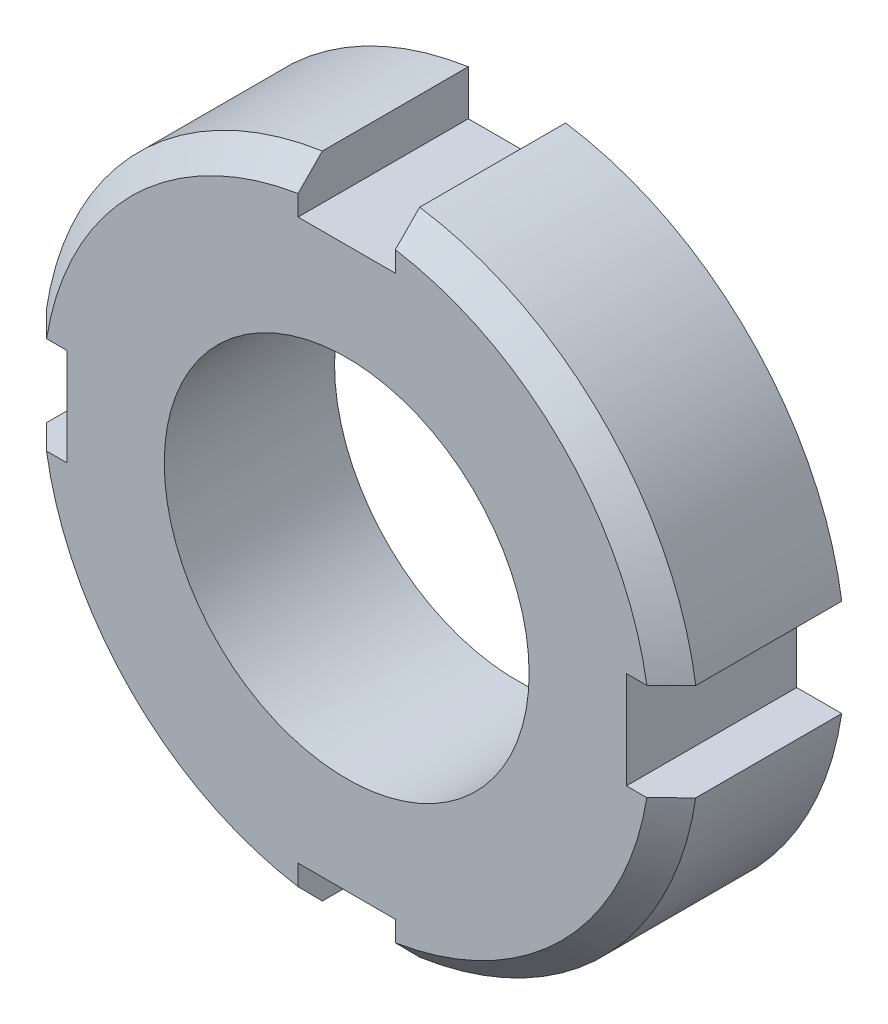
ISO-10303-21;
HEADER;
FILE_DESCRIPTION(('STEP AP214'),'2;1');
FILE_NAME('part.step','',(''),(''),'','','');
FILE_SCHEMA(('AUTOMOTIVE_DESIGN { 1 0 10303 214 1 1 1 1 }'));
ENDSEC;
DATA;
#1=APPLICATION_CONTEXT('core data for automotive mechanical design processes');
#2=APPLICATION_PROTOCOL_DEFINITION('international standard','automotive_design',2000,#1);
#3=PRODUCT_CONTEXT('',#1,'mechanical');
#4=PRODUCT('Part','Part','',(#3));
#5=PRODUCT_RELATED_PRODUCT_CATEGORY('part','',(#4));
#6=PRODUCT_DEFINITION_FORMATION('','',#4);
#7=PRODUCT_DEFINITION_CONTEXT('part definition',#1,'design');
#8=PRODUCT_DEFINITION('design','',#6,#7);
#9=PRODUCT_DEFINITION_SHAPE('','',#8);
#10=(LENGTH_UNIT() NAMED_UNIT(*) SI_UNIT(.MILLI.,.METRE.));
#11=(NAMED_UNIT(*) PLANE_ANGLE_UNIT() SI_UNIT($,.RADIAN.));
#12=(NAMED_UNIT(*) SI_UNIT($,.STERADIAN.) SOLID_ANGLE_UNIT());
#13=UNCERTAINTY_MEASURE_WITH_UNIT(LENGTH_MEASURE(1.E-05),#10,'distance_accuracy_value','');
#14=(GEOMETRIC_REPRESENTATION_CONTEXT(3) GLOBAL_UNCERTAINTY_ASSIGNED_CONTEXT((#13)) GLOBAL_UNIT_ASSIGNED_CONTEXT((#10,
#11,#12)) REPRESENTATION_CONTEXT('',''));
#15=CARTESIAN_POINT('',(0.,0.,0.));
#16=DIRECTION('',(0.,0.,1.));
#17=DIRECTION('',(1.,0.,0.));
#18=AXIS2_PLACEMENT_3D('',#15,#16,#17);
#19=CARTESIAN_POINT('',(0.,0.,7.));
#20=DIRECTION('',(0.,0.,-1.));
#21=DIRECTION('',(-1.,0.,0.));
#22=AXIS2_PLACEMENT_3D('',#19,#20,#21);
#23=CYLINDRICAL_SURFACE('',#22,13.5);
#24=DIRECTION('',(0.,0.,-1.));
#25=VECTOR('',#24,1.);
#26=CARTESIAN_POINT('',(-13.3510299228187,2.00000000000014,7.));
#27=LINE('',#26,#25);
#28=CARTESIAN_POINT('',(-13.3510299228187,2.00000000000014,0.));
#29=VERTEX_POINT('',#28);
#30=CARTESIAN_POINT('',(-13.3510299228187,2.00000000000014,6.));
#31=VERTEX_POINT('',#30);
#32=EDGE_CURVE('E190',#29,#31,#27,.F.);
#33=ORIENTED_EDGE('',*,*,#32,.T.);
#34=CARTESIAN_POINT('',(0.,0.,6.));
#35=DIRECTION('',(0.,0.,1.));
#36=DIRECTION('',(1.,0.,0.));
#37=AXIS2_PLACEMENT_3D('',#34,#35,#36);
#38=CIRCLE('',#37,13.5);
#39=CARTESIAN_POINT('',(-2.,13.3510299228187,6.));
#40=VERTEX_POINT('',#39);
#41=EDGE_CURVE('E48',#31,#40,#38,.F.);
#42=ORIENTED_EDGE('',*,*,#41,.T.);
#43=DIRECTION('',(0.,0.,-1.));
#44=VECTOR('',#43,1.);
#45=CARTESIAN_POINT('',(-2.,13.3510299228187,7.));
#46=LINE('',#45,#44);
#47=CARTESIAN_POINT('',(-2.,13.3510299228187,0.));
#48=VERTEX_POINT('',#47);
#49=EDGE_CURVE('E275',#40,#48,#46,.T.);
#50=ORIENTED_EDGE('',*,*,#49,.T.);
#51=CARTESIAN_POINT('',(0.,0.,0.));
#52=DIRECTION('',(0.,0.,1.));
#53=DIRECTION('',(1.,0.,0.));
#54=AXIS2_PLACEMENT_3D('',#51,#52,#53);
#55=CIRCLE('',#54,13.5);
#56=EDGE_CURVE('E289',#48,#29,#55,.T.);
#57=ORIENTED_EDGE('',*,*,#56,.T.);
#58=EDGE_LOOP('',(#33,#42,#50,#57));
#59=FACE_BOUND('',#58,.T.);
#60=ADVANCED_FACE('F35',(#59),#23,.T.);
#61=DIRECTION('',(0.,0.,-1.));
#62=VECTOR('',#61,1.);
#63=CARTESIAN_POINT('',(-2.00000000000009,-13.3510299228187,7.));
#64=LINE('',#63,#62);
#65=CARTESIAN_POINT('',(-2.00000000000009,-13.3510299228187,0.));
#66=VERTEX_POINT('',#65);
#67=CARTESIAN_POINT('',(-2.00000000000009,-13.3510299228187,5.99999999999999));
#68=VERTEX_POINT('',#67);
#69=EDGE_CURVE('E231',#66,#68,#64,.F.);
#70=ORIENTED_EDGE('',*,*,#69,.T.);
#71=CARTESIAN_POINT('',(0.,0.,5.99999999999999));
#72=DIRECTION('',(0.,0.,1.));
#73=DIRECTION('',(1.,0.,0.));
#74=AXIS2_PLACEMENT_3D('',#71,#72,#73);
#75=CIRCLE('',#74,13.5);
#76=CARTESIAN_POINT('',(-13.3510299228187,-1.99999999999986,5.99999999999999));
#77=VERTEX_POINT('',#76);
#78=EDGE_CURVE('E453',#68,#77,#75,.F.);
#79=ORIENTED_EDGE('',*,*,#78,.T.);
#80=DIRECTION('',(0.,0.,-1.));
#81=VECTOR('',#80,1.);
#82=CARTESIAN_POINT('',(-13.3510299228187,-1.99999999999986,7.));
#83=LINE('',#82,#81);
#84=CARTESIAN_POINT('',(-13.3510299228187,-1.99999999999986,0.));
#85=VERTEX_POINT('',#84);
#86=EDGE_CURVE('E184',#77,#85,#83,.T.);
#87=ORIENTED_EDGE('',*,*,#86,.T.);
#88=EDGE_CURVE('E292',#85,#66,#55,.T.);
#89=ORIENTED_EDGE('',*,*,#88,.T.);
#90=EDGE_LOOP('',(#70,#79,#87,#89));
#91=FACE_BOUND('',#90,.T.);
#92=ADVANCED_FACE('F352',(#91),#23,.T.);
#93=DIRECTION('',(0.,0.,-1.));
#94=VECTOR('',#93,1.);
#95=CARTESIAN_POINT('',(13.3510299228187,-2.00000000000005,7.));
#96=LINE('',#95,#94);
#97=CARTESIAN_POINT('',(13.3510299228187,-2.00000000000005,0.));
#98=VERTEX_POINT('',#97);
#99=CARTESIAN_POINT('',(13.3510299228187,-2.00000000000005,6.));
#100=VERTEX_POINT('',#99);
#101=EDGE_CURVE('E255',#98,#100,#96,.F.);
#102=ORIENTED_EDGE('',*,*,#101,.T.);
#103=CARTESIAN_POINT('',(0.,0.,6.));
#104=DIRECTION('',(0.,0.,1.));
#105=DIRECTION('',(1.,0.,0.));
#106=AXIS2_PLACEMENT_3D('',#103,#104,#105);
#107=CIRCLE('',#106,13.5);
#108=CARTESIAN_POINT('',(1.99999999999991,-13.3510299228187,6.));
#109=VERTEX_POINT('',#108);
#110=EDGE_CURVE('E400',#100,#109,#107,.F.);
#111=ORIENTED_EDGE('',*,*,#110,.T.);
#112=DIRECTION('',(0.,0.,-1.));
#113=VECTOR('',#112,1.);
#114=CARTESIAN_POINT('',(1.99999999999991,-13.3510299228187,7.));
#115=LINE('',#114,#113);
#116=CARTESIAN_POINT('',(1.99999999999991,-13.3510299228187,0.));
#117=VERTEX_POINT('',#116);
#118=EDGE_CURVE('E227',#109,#117,#115,.T.);
#119=ORIENTED_EDGE('',*,*,#118,.T.);
#120=EDGE_CURVE('E457',#117,#98,#55,.T.);
#121=ORIENTED_EDGE('',*,*,#120,.T.);
#122=EDGE_LOOP('',(#102,#111,#119,#121));
#123=FACE_BOUND('',#122,.T.);
#124=ADVANCED_FACE('F347',(#123),#23,.T.);
#125=DIRECTION('',(0.,0.,-1.));
#126=VECTOR('',#125,1.);
#127=CARTESIAN_POINT('',(2.,13.3510299228187,7.));
#128=LINE('',#127,#126);
#129=CARTESIAN_POINT('',(2.,13.3510299228187,0.));
#130=VERTEX_POINT('',#129);
#131=CARTESIAN_POINT('',(2.,13.3510299228187,6.));
#132=VERTEX_POINT('',#131);
#133=EDGE_CURVE('E279',#130,#132,#128,.F.);
#134=ORIENTED_EDGE('',*,*,#133,.T.);
#135=CARTESIAN_POINT('',(0.,0.,6.));
#136=DIRECTION('',(0.,0.,1.));
#137=DIRECTION('',(1.,0.,0.));
#138=AXIS2_PLACEMENT_3D('',#135,#136,#137);
#139=CIRCLE('',#138,13.5);
#140=CARTESIAN_POINT('',(13.3510299228187,1.99999999999995,6.));
#141=VERTEX_POINT('',#140);
#142=EDGE_CURVE('E321',#132,#141,#139,.F.);
#143=ORIENTED_EDGE('',*,*,#142,.T.);
#144=DIRECTION('',(0.,0.,-1.));
#145=VECTOR('',#144,1.);
#146=CARTESIAN_POINT('',(13.3510299228187,1.99999999999995,7.));
#147=LINE('',#146,#145);
#148=CARTESIAN_POINT('',(13.3510299228187,1.99999999999995,0.));
#149=VERTEX_POINT('',#148);
#150=EDGE_CURVE('E251',#141,#149,#147,.T.);
#151=ORIENTED_EDGE('',*,*,#150,.T.);
#152=EDGE_CURVE('E286',#149,#130,#55,.T.);
#153=ORIENTED_EDGE('',*,*,#152,.T.);
#154=EDGE_LOOP('',(#134,#143,#151,#153));
#155=FACE_BOUND('',#154,.T.);
#156=ADVANCED_FACE('F342',(#155),#23,.T.);
#157=CARTESIAN_POINT('',(0.,0.,7.));
#158=DIRECTION('',(0.,0.,1.));
#159=DIRECTION('',(1.,0.,0.));
#160=AXIS2_PLACEMENT_3D('',#157,#158,#159);
#161=PLANE('',#160);
#162=DIRECTION('',(-1.,0.,0.));
#163=VECTOR('',#162,1.);
#164=CARTESIAN_POINT('',(15.5,1.99999999999995,7.));
#165=LINE('',#164,#163);
#166=CARTESIAN_POINT('',(12.3389626792531,1.99999999999996,7.));
#167=VERTEX_POINT('',#166);
#168=CARTESIAN_POINT('',(11.5,1.99999999999996,7.));
#169=VERTEX_POINT('',#168);
#170=EDGE_CURVE('E245',#167,#169,#165,.T.);
#171=ORIENTED_EDGE('',*,*,#170,.F.);
#172=CARTESIAN_POINT('',(0.,0.,7.));
#173=DIRECTION('',(0.,0.,1.));
#174=DIRECTION('',(1.,0.,0.));
#175=AXIS2_PLACEMENT_3D('',#172,#173,#174);
#176=CIRCLE('',#175,12.5);
#177=CARTESIAN_POINT('',(2.,12.3389626792531,7.));
#178=VERTEX_POINT('',#177);
#179=EDGE_CURVE('E311',#167,#178,#176,.T.);
#180=ORIENTED_EDGE('',*,*,#179,.T.);
#181=DIRECTION('',(0.,1.,0.));
#182=VECTOR('',#181,1.);
#183=CARTESIAN_POINT('',(2.,15.5,7.));
#184=LINE('',#183,#182);
#185=CARTESIAN_POINT('',(2.,11.5,7.));
#186=VERTEX_POINT('',#185);
#187=EDGE_CURVE('E258',#186,#178,#184,.T.);
#188=ORIENTED_EDGE('',*,*,#187,.F.);
#189=DIRECTION('',(1.,0.,0.));
#190=VECTOR('',#189,1.);
#191=CARTESIAN_POINT('',(-2.,11.5,7.));
#192=LINE('',#191,#190);
#193=CARTESIAN_POINT('',(-2.,11.5,7.));
#194=VERTEX_POINT('',#193);
#195=EDGE_CURVE('E263',#194,#186,#192,.T.);
#196=ORIENTED_EDGE('',*,*,#195,.F.);
#197=DIRECTION('',(0.,-1.,0.));
#198=VECTOR('',#197,1.);
#199=CARTESIAN_POINT('',(-2.,15.5,7.));
#200=LINE('',#199,#198);
#201=CARTESIAN_POINT('',(-2.,12.3389626792531,7.));
#202=VERTEX_POINT('',#201);
#203=EDGE_CURVE('E269',#202,#194,#200,.T.);
#204=ORIENTED_EDGE('',*,*,#203,.F.);
#205=CARTESIAN_POINT('',(0.,0.,7.));
#206=DIRECTION('',(0.,0.,1.));
#207=DIRECTION('',(1.,0.,0.));
#208=AXIS2_PLACEMENT_3D('',#205,#206,#207);
#209=CIRCLE('',#208,12.5);
#210=CARTESIAN_POINT('',(-12.338962679253,2.00000000000013,7.));
#211=VERTEX_POINT('',#210);
#212=EDGE_CURVE('E302',#202,#211,#209,.T.);
#213=ORIENTED_EDGE('',*,*,#212,.T.);
#214=DIRECTION('',(-1.,0.,0.));
#215=VECTOR('',#214,1.);
#216=CARTESIAN_POINT('',(-15.5,2.00000000000016,7.));
#217=LINE('',#216,#215);
#218=CARTESIAN_POINT('',(-11.5,2.00000000000012,7.));
#219=VERTEX_POINT('',#218);
#220=EDGE_CURVE('E203',#219,#211,#217,.T.);
#221=ORIENTED_EDGE('',*,*,#220,.F.);
#222=DIRECTION('',(0.,1.,0.));
#223=VECTOR('',#222,1.);
#224=CARTESIAN_POINT('',(-11.5,-1.99999999999988,7.));
#225=LINE('',#224,#223);
#226=CARTESIAN_POINT('',(-11.5,-1.99999999999988,7.));
#227=VERTEX_POINT('',#226);
#228=EDGE_CURVE('E182',#227,#219,#225,.T.);
#229=ORIENTED_EDGE('',*,*,#228,.F.);
#230=DIRECTION('',(1.,0.,0.));
#231=VECTOR('',#230,1.);
#232=CARTESIAN_POINT('',(-15.5,-1.99999999999984,7.));
#233=LINE('',#232,#231);
#234=CARTESIAN_POINT('',(-12.3389626792531,-1.99999999999987,7.));
#235=VERTEX_POINT('',#234);
#236=EDGE_CURVE('E205',#235,#227,#233,.T.);
#237=ORIENTED_EDGE('',*,*,#236,.F.);
#238=CARTESIAN_POINT('',(0.,0.,7.));
#239=DIRECTION('',(0.,0.,1.));
#240=DIRECTION('',(1.,0.,0.));
#241=AXIS2_PLACEMENT_3D('',#238,#239,#240);
#242=CIRCLE('',#241,12.5);
#243=CARTESIAN_POINT('',(-2.00000000000009,-12.3389626792531,7.));
#244=VERTEX_POINT('',#243);
#245=EDGE_CURVE('E305',#235,#244,#242,.T.);
#246=ORIENTED_EDGE('',*,*,#245,.T.);
#247=DIRECTION('',(0.,-1.,0.));
#248=VECTOR('',#247,1.);
#249=CARTESIAN_POINT('',(-2.00000000000011,-15.5,7.));
#250=LINE('',#249,#248);
#251=CARTESIAN_POINT('',(-2.00000000000008,-11.5,7.));
#252=VERTEX_POINT('',#251);
#253=EDGE_CURVE('E210',#252,#244,#250,.T.);
#254=ORIENTED_EDGE('',*,*,#253,.F.);
#255=DIRECTION('',(-1.,0.,0.));
#256=VECTOR('',#255,1.);
#257=CARTESIAN_POINT('',(1.99999999999992,-11.5,7.));
#258=LINE('',#257,#256);
#259=CARTESIAN_POINT('',(1.99999999999992,-11.5,7.));
#260=VERTEX_POINT('',#259);
#261=EDGE_CURVE('E215',#260,#252,#258,.T.);
#262=ORIENTED_EDGE('',*,*,#261,.F.);
#263=DIRECTION('',(0.,1.,0.));
#264=VECTOR('',#263,1.);
#265=CARTESIAN_POINT('',(1.99999999999989,-15.5,7.));
#266=LINE('',#265,#264);
#267=CARTESIAN_POINT('',(1.99999999999991,-12.3389626792531,7.));
#268=VERTEX_POINT('',#267);
#269=EDGE_CURVE('E221',#268,#260,#266,.T.);
#270=ORIENTED_EDGE('',*,*,#269,.F.);
#271=CARTESIAN_POINT('',(0.,0.,7.));
#272=DIRECTION('',(0.,0.,1.));
#273=DIRECTION('',(1.,0.,0.));
#274=AXIS2_PLACEMENT_3D('',#271,#272,#273);
#275=CIRCLE('',#274,12.5);
#276=CARTESIAN_POINT('',(12.3389626792531,-2.00000000000004,7.));
#277=VERTEX_POINT('',#276);
#278=EDGE_CURVE('E308',#268,#277,#275,.T.);
#279=ORIENTED_EDGE('',*,*,#278,.T.);
#280=DIRECTION('',(1.,0.,0.));
#281=VECTOR('',#280,1.);
#282=CARTESIAN_POINT('',(15.5,-2.00000000000005,7.));
#283=LINE('',#282,#281);
#284=CARTESIAN_POINT('',(11.5,-2.00000000000004,7.));
#285=VERTEX_POINT('',#284);
#286=EDGE_CURVE('E234',#285,#277,#283,.T.);
#287=ORIENTED_EDGE('',*,*,#286,.F.);
#288=DIRECTION('',(0.,-1.,0.));
#289=VECTOR('',#288,1.);
#290=CARTESIAN_POINT('',(11.5,1.99999999999996,7.));
#291=LINE('',#290,#289);
#292=EDGE_CURVE('E239',#169,#285,#291,.T.);
#293=ORIENTED_EDGE('',*,*,#292,.F.);
#294=EDGE_LOOP('',(#171,#180,#188,#196,#204,#213,#221,#229,#237,#246,#254,#262,#270,#279,#287,#293));
#295=FACE_BOUND('',#294,.T.);
#296=CARTESIAN_POINT('',(0.,0.,7.));
#297=DIRECTION('',(0.,0.,1.));
#298=DIRECTION('',(1.,0.,0.));
#299=AXIS2_PLACEMENT_3D('',#296,#297,#298);
#300=CIRCLE('',#299,7.5);
#301=CARTESIAN_POINT('',(7.5,0.,7.));
#302=VERTEX_POINT('',#301);
#303=EDGE_CURVE('E282',#302,#302,#300,.T.);
#304=ORIENTED_EDGE('',*,*,#303,.F.);
#305=EDGE_LOOP('',(#304));
#306=FACE_BOUND('',#305,.T.);
#307=ADVANCED_FACE('F339',(#295,#306),#161,.T.);
#308=CARTESIAN_POINT('',(0.,0.,0.));
#309=DIRECTION('',(0.,0.,1.));
#310=DIRECTION('',(1.,0.,0.));
#311=AXIS2_PLACEMENT_3D('',#308,#309,#310);
#312=PLANE('',#311);
#313=CARTESIAN_POINT('',(0.,0.,0.));
#314=DIRECTION('',(0.,0.,1.));
#315=DIRECTION('',(1.,0.,0.));
#316=AXIS2_PLACEMENT_3D('',#313,#314,#315);
#317=CIRCLE('',#316,7.5);
#318=CARTESIAN_POINT('',(7.5,0.,0.));
#319=VERTEX_POINT('',#318);
#320=EDGE_CURVE('E283',#319,#319,#317,.T.);
#321=ORIENTED_EDGE('',*,*,#320,.T.);
#322=EDGE_LOOP('',(#321));
#323=FACE_BOUND('',#322,.T.);
#324=DIRECTION('',(0.,1.,0.));
#325=VECTOR('',#324,1.);
#326=CARTESIAN_POINT('',(-11.5,-1.99999999999988,0.));
#327=LINE('',#326,#325);
#328=CARTESIAN_POINT('',(-11.5,-1.99999999999988,0.));
#329=VERTEX_POINT('',#328);
#330=CARTESIAN_POINT('',(-11.5,2.00000000000012,0.));
#331=VERTEX_POINT('',#330);
#332=EDGE_CURVE('E179',#329,#331,#327,.T.);
#333=ORIENTED_EDGE('',*,*,#332,.T.);
#334=DIRECTION('',(-1.,0.,0.));
#335=VECTOR('',#334,1.);
#336=CARTESIAN_POINT('',(-15.5,2.00000000000016,0.));
#337=LINE('',#336,#335);
#338=EDGE_CURVE('E188',#331,#29,#337,.T.);
#339=ORIENTED_EDGE('',*,*,#338,.T.);
#340=ORIENTED_EDGE('',*,*,#56,.F.);
#341=DIRECTION('',(0.,-1.,0.));
#342=VECTOR('',#341,1.);
#343=CARTESIAN_POINT('',(-2.,0.,0.));
#344=LINE('',#343,#342);
#345=CARTESIAN_POINT('',(-2.,11.5,0.));
#346=VERTEX_POINT('',#345);
#347=EDGE_CURVE('E291',#48,#346,#344,.T.);
#348=ORIENTED_EDGE('',*,*,#347,.T.);
#349=DIRECTION('',(1.,0.,0.));
#350=VECTOR('',#349,1.);
#351=CARTESIAN_POINT('',(-2.,11.5,0.));
#352=LINE('',#351,#350);
#353=CARTESIAN_POINT('',(2.,11.5,0.));
#354=VERTEX_POINT('',#353);
#355=EDGE_CURVE('E262',#346,#354,#352,.T.);
#356=ORIENTED_EDGE('',*,*,#355,.T.);
#357=DIRECTION('',(0.,1.,0.));
#358=VECTOR('',#357,1.);
#359=CARTESIAN_POINT('',(2.,15.5,0.));
#360=LINE('',#359,#358);
#361=EDGE_CURVE('E259',#354,#130,#360,.T.);
#362=ORIENTED_EDGE('',*,*,#361,.T.);
#363=ORIENTED_EDGE('',*,*,#152,.F.);
#364=DIRECTION('',(-1.,0.,0.));
#365=VECTOR('',#364,1.);
#366=CARTESIAN_POINT('',(0.,2.,0.));
#367=LINE('',#366,#365);
#368=CARTESIAN_POINT('',(11.5,1.99999999999996,0.));
#369=VERTEX_POINT('',#368);
#370=EDGE_CURVE('E295',#149,#369,#367,.T.);
#371=ORIENTED_EDGE('',*,*,#370,.T.);
#372=DIRECTION('',(0.,-1.,0.));
#373=VECTOR('',#372,1.);
#374=CARTESIAN_POINT('',(11.5,1.99999999999996,0.));
#375=LINE('',#374,#373);
#376=CARTESIAN_POINT('',(11.5,-2.00000000000004,0.));
#377=VERTEX_POINT('',#376);
#378=EDGE_CURVE('E238',#369,#377,#375,.T.);
#379=ORIENTED_EDGE('',*,*,#378,.T.);
#380=DIRECTION('',(1.,0.,0.));
#381=VECTOR('',#380,1.);
#382=CARTESIAN_POINT('',(15.5,-2.00000000000005,0.));
#383=LINE('',#382,#381);
#384=EDGE_CURVE('E235',#377,#98,#383,.T.);
#385=ORIENTED_EDGE('',*,*,#384,.T.);
#386=ORIENTED_EDGE('',*,*,#120,.F.);
#387=DIRECTION('',(0.,1.,0.));
#388=VECTOR('',#387,1.);
#389=CARTESIAN_POINT('',(2.,0.,0.));
#390=LINE('',#389,#388);
#391=CARTESIAN_POINT('',(1.99999999999992,-11.5,0.));
#392=VERTEX_POINT('',#391);
#393=EDGE_CURVE('E298',#117,#392,#390,.T.);
#394=ORIENTED_EDGE('',*,*,#393,.T.);
#395=DIRECTION('',(-1.,0.,0.));
#396=VECTOR('',#395,1.);
#397=CARTESIAN_POINT('',(1.99999999999992,-11.5,0.));
#398=LINE('',#397,#396);
#399=CARTESIAN_POINT('',(-2.00000000000008,-11.5,0.));
#400=VERTEX_POINT('',#399);
#401=EDGE_CURVE('E214',#392,#400,#398,.T.);
#402=ORIENTED_EDGE('',*,*,#401,.T.);
#403=DIRECTION('',(0.,-1.,0.));
#404=VECTOR('',#403,1.);
#405=CARTESIAN_POINT('',(-2.00000000000011,-15.5,0.));
#406=LINE('',#405,#404);
#407=EDGE_CURVE('E211',#400,#66,#406,.T.);
#408=ORIENTED_EDGE('',*,*,#407,.T.);
#409=ORIENTED_EDGE('',*,*,#88,.F.);
#410=DIRECTION('',(1.,0.,0.));
#411=VECTOR('',#410,1.);
#412=CARTESIAN_POINT('',(0.,-2.,0.));
#413=LINE('',#412,#411);
#414=EDGE_CURVE('E199',#85,#329,#413,.T.);
#415=ORIENTED_EDGE('',*,*,#414,.T.);
#416=EDGE_LOOP('',(#333,#339,#340,#348,#356,#362,#363,#371,#379,#385,#386,#394,#402,#408,#409,#415));
#417=FACE_BOUND('',#416,.T.);
#418=ADVANCED_FACE('F196',(#323,#417),#312,.F.);
#419=CARTESIAN_POINT('',(0.,0.,0.));
#420=DIRECTION('',(0.,0.,1.));
#421=DIRECTION('',(1.,0.,0.));
#422=AXIS2_PLACEMENT_3D('',#419,#420,#421);
#423=CYLINDRICAL_SURFACE('',#422,7.5);
#424=ORIENTED_EDGE('',*,*,#320,.F.);
#425=EDGE_LOOP('',(#424));
#426=FACE_BOUND('',#425,.T.);
#427=ORIENTED_EDGE('',*,*,#303,.T.);
#428=EDGE_LOOP('',(#427));
#429=FACE_BOUND('',#428,.T.);
#430=ADVANCED_FACE('F332',(#426,#429),#423,.F.);
#431=CARTESIAN_POINT('',(2.,15.5,0.));
#432=DIRECTION('',(1.,0.,0.));
#433=DIRECTION('',(0.,0.,-1.));
#434=AXIS2_PLACEMENT_3D('',#431,#432,#433);
#435=PLANE('',#434);
#436=ORIENTED_EDGE('',*,*,#187,.T.);
#437=CARTESIAN_POINT('',(2.,12.3389626792531,7.));
#438=CARTESIAN_POINT('',(2.,12.5077183687956,6.83341208726108));
#439=CARTESIAN_POINT('',(2.,12.6764351507074,6.66678479738353));
#440=CARTESIAN_POINT('',(2.,13.0137908985623,6.33345146404986));
#441=CARTESIAN_POINT('',(2.,13.1824298645057,6.16674542059408));
#442=CARTESIAN_POINT('',(2.,13.3510299228187,6.));
#443=B_SPLINE_CURVE_WITH_KNOTS('',3,(#437,#438,#439,#440,#441,#442),.UNSPECIFIED.,.F.,.F.,(4,2,
4),(0.,0.711386010598617,1.422772018215),.UNSPECIFIED.);
#444=EDGE_CURVE('E314',#178,#132,#443,.T.);
#445=ORIENTED_EDGE('',*,*,#444,.T.);
#446=ORIENTED_EDGE('',*,*,#133,.F.);
#447=ORIENTED_EDGE('',*,*,#361,.F.);
#448=DIRECTION('',(0.,0.,1.));
#449=VECTOR('',#448,1.);
#450=CARTESIAN_POINT('',(2.,11.5,0.));
#451=LINE('',#450,#449);
#452=EDGE_CURVE('E273',#354,#186,#451,.T.);
#453=ORIENTED_EDGE('',*,*,#452,.T.);
#454=EDGE_LOOP('',(#436,#445,#446,#447,#453));
#455=FACE_BOUND('',#454,.T.);
#456=ADVANCED_FACE('F327',(#455),#435,.F.);
#457=CARTESIAN_POINT('',(-2.,15.5,0.));
#458=DIRECTION('',(-1.,0.,0.));
#459=DIRECTION('',(0.,-1.,0.));
#460=AXIS2_PLACEMENT_3D('',#457,#458,#459);
#461=PLANE('',#460);
#462=ORIENTED_EDGE('',*,*,#49,.F.);
#463=CARTESIAN_POINT('',(-2.,13.3510299228187,6.));
#464=CARTESIAN_POINT('',(-2.,13.1824298645057,6.16674542059408));
#465=CARTESIAN_POINT('',(-2.,13.0137908985623,6.33345146404986));
#466=CARTESIAN_POINT('',(-2.,12.6764351507074,6.66678479738353));
#467=CARTESIAN_POINT('',(-2.,12.5077183687956,6.83341208726108));
#468=CARTESIAN_POINT('',(-2.,12.3389626792531,7.));
#469=B_SPLINE_CURVE_WITH_KNOTS('',3,(#463,#464,#465,#466,#467,#468),.UNSPECIFIED.,.F.,.F.,(4,2,
4),(0.,0.711386007616384,1.422772018215),.UNSPECIFIED.);
#470=EDGE_CURVE('E11',#40,#202,#469,.T.);
#471=ORIENTED_EDGE('',*,*,#470,.T.);
#472=ORIENTED_EDGE('',*,*,#203,.T.);
#473=DIRECTION('',(0.,0.,1.));
#474=VECTOR('',#473,1.);
#475=CARTESIAN_POINT('',(-2.,11.5,0.));
#476=LINE('',#475,#474);
#477=EDGE_CURVE('E266',#346,#194,#476,.T.);
#478=ORIENTED_EDGE('',*,*,#477,.F.);
#479=ORIENTED_EDGE('',*,*,#347,.F.);
#480=EDGE_LOOP('',(#462,#471,#472,#478,#479));
#481=FACE_BOUND('',#480,.T.);
#482=ADVANCED_FACE('F331',(#481),#461,.F.);
#483=CARTESIAN_POINT('',(-2.,11.5,0.));
#484=DIRECTION('',(0.,-1.,0.));
#485=DIRECTION('',(0.,0.,-1.));
#486=AXIS2_PLACEMENT_3D('',#483,#484,#485);
#487=PLANE('',#486);
#488=ORIENTED_EDGE('',*,*,#195,.T.);
#489=ORIENTED_EDGE('',*,*,#452,.F.);
#490=ORIENTED_EDGE('',*,*,#355,.F.);
#491=ORIENTED_EDGE('',*,*,#477,.T.);
#492=EDGE_LOOP('',(#488,#489,#490,#491));
#493=FACE_BOUND('',#492,.T.);
#494=ADVANCED_FACE('F426',(#493),#487,.F.);
#495=CARTESIAN_POINT('',(15.5,-2.00000000000005,0.));
#496=DIRECTION('',(0.,-1.,0.));
#497=DIRECTION('',(1.,0.,0.));
#498=AXIS2_PLACEMENT_3D('',#495,#496,#497);
#499=PLANE('',#498);
#500=ORIENTED_EDGE('',*,*,#286,.T.);
#501=CARTESIAN_POINT('',(12.3389626792531,-2.00000000000004,7.));
#502=CARTESIAN_POINT('',(12.5077183687956,-2.00000000000004,6.83341208726108));
#503=CARTESIAN_POINT('',(12.6764351507074,-2.00000000000005,6.66678479738353));
#504=CARTESIAN_POINT('',(13.0137908985623,-2.00000000000005,6.33345146404986));
#505=CARTESIAN_POINT('',(13.1824298645057,-2.00000000000005,6.16674542059408));
#506=CARTESIAN_POINT('',(13.3510299228187,-2.00000000000005,6.));
#507=B_SPLINE_CURVE_WITH_KNOTS('',3,(#501,#502,#503,#504,#505,#506),.UNSPECIFIED.,.F.,.F.,(4,2,
4),(0.,0.711386010598614,1.42277201821499),.UNSPECIFIED.);
#508=EDGE_CURVE('E412',#277,#100,#507,.T.);
#509=ORIENTED_EDGE('',*,*,#508,.T.);
#510=ORIENTED_EDGE('',*,*,#101,.F.);
#511=ORIENTED_EDGE('',*,*,#384,.F.);
#512=DIRECTION('',(0.,0.,1.));
#513=VECTOR('',#512,1.);
#514=CARTESIAN_POINT('',(11.5,-2.00000000000004,0.));
#515=LINE('',#514,#513);
#516=EDGE_CURVE('E249',#377,#285,#515,.T.);
#517=ORIENTED_EDGE('',*,*,#516,.T.);
#518=EDGE_LOOP('',(#500,#509,#510,#511,#517));
#519=FACE_BOUND('',#518,.T.);
#520=ADVANCED_FACE('F422',(#519),#499,.F.);
#521=CARTESIAN_POINT('',(15.5,1.99999999999995,0.));
#522=DIRECTION('',(0.,1.,0.));
#523=DIRECTION('',(-1.,0.,0.));
#524=AXIS2_PLACEMENT_3D('',#521,#522,#523);
#525=PLANE('',#524);
#526=ORIENTED_EDGE('',*,*,#150,.F.);
#527=CARTESIAN_POINT('',(13.3510299228187,1.99999999999995,6.));
#528=CARTESIAN_POINT('',(13.1824298645057,1.99999999999995,6.16674542059408));
#529=CARTESIAN_POINT('',(13.0137908985623,1.99999999999995,6.33345146404986));
#530=CARTESIAN_POINT('',(12.6764351507074,1.99999999999996,6.66678479738353));
#531=CARTESIAN_POINT('',(12.5077183687956,1.99999999999996,6.83341208726108));
#532=CARTESIAN_POINT('',(12.3389626792531,1.99999999999996,7.));
#533=B_SPLINE_CURVE_WITH_KNOTS('',3,(#527,#528,#529,#530,#531,#532),.UNSPECIFIED.,.F.,.F.,(4,2,
4),(0.,0.711386007616382,1.422772018215),.UNSPECIFIED.);
#534=EDGE_CURVE('E417',#141,#167,#533,.T.);
#535=ORIENTED_EDGE('',*,*,#534,.T.);
#536=ORIENTED_EDGE('',*,*,#170,.T.);
#537=DIRECTION('',(0.,0.,1.));
#538=VECTOR('',#537,1.);
#539=CARTESIAN_POINT('',(11.5,1.99999999999996,0.));
#540=LINE('',#539,#538);
#541=EDGE_CURVE('E242',#369,#169,#540,.T.);
#542=ORIENTED_EDGE('',*,*,#541,.F.);
#543=ORIENTED_EDGE('',*,*,#370,.F.);
#544=EDGE_LOOP('',(#526,#535,#536,#542,#543));
#545=FACE_BOUND('',#544,.T.);
#546=ADVANCED_FACE('F425',(#545),#525,.F.);
#547=CARTESIAN_POINT('',(11.5,1.99999999999996,0.));
#548=DIRECTION('',(-1.,0.,0.));
#549=DIRECTION('',(0.,-1.,0.));
#550=AXIS2_PLACEMENT_3D('',#547,#548,#549);
#551=PLANE('',#550);
#552=ORIENTED_EDGE('',*,*,#292,.T.);
#553=ORIENTED_EDGE('',*,*,#516,.F.);
#554=ORIENTED_EDGE('',*,*,#378,.F.);
#555=ORIENTED_EDGE('',*,*,#541,.T.);
#556=EDGE_LOOP('',(#552,#553,#554,#555));
#557=FACE_BOUND('',#556,.T.);
#558=ADVANCED_FACE('F479',(#557),#551,.F.);
#559=CARTESIAN_POINT('',(-2.00000000000011,-15.5,0.));
#560=DIRECTION('',(-1.,0.,0.));
#561=DIRECTION('',(0.,-1.,0.));
#562=AXIS2_PLACEMENT_3D('',#559,#560,#561);
#563=PLANE('',#562);
#564=ORIENTED_EDGE('',*,*,#253,.T.);
#565=CARTESIAN_POINT('',(-2.00000000000009,-12.3389626792531,7.));
#566=CARTESIAN_POINT('',(-2.00000000000009,-12.5077183687956,6.83341208726108));
#567=CARTESIAN_POINT('',(-2.00000000000009,-12.6764351507074,6.66678479738352));
#568=CARTESIAN_POINT('',(-2.00000000000009,-13.0137908985622,6.33345146404986));
#569=CARTESIAN_POINT('',(-2.00000000000009,-13.1824298645057,6.16674542059407));
#570=CARTESIAN_POINT('',(-2.00000000000009,-13.3510299228187,5.99999999999999));
#571=B_SPLINE_CURVE_WITH_KNOTS('',3,(#565,#566,#567,#568,#569,#570),.UNSPECIFIED.,.F.,.F.,(4,2,
4),(0.,0.711386010598619,1.422772018215),.UNSPECIFIED.);
#572=EDGE_CURVE('E399',#244,#68,#571,.T.);
#573=ORIENTED_EDGE('',*,*,#572,.T.);
#574=ORIENTED_EDGE('',*,*,#69,.F.);
#575=ORIENTED_EDGE('',*,*,#407,.F.);
#576=DIRECTION('',(0.,0.,1.));
#577=VECTOR('',#576,1.);
#578=CARTESIAN_POINT('',(-2.00000000000008,-11.5,0.));
#579=LINE('',#578,#577);
#580=EDGE_CURVE('E225',#400,#252,#579,.T.);
#581=ORIENTED_EDGE('',*,*,#580,.T.);
#582=EDGE_LOOP('',(#564,#573,#574,#575,#581));
#583=FACE_BOUND('',#582,.T.);
#584=ADVANCED_FACE('F388',(#583),#563,.F.);
#585=CARTESIAN_POINT('',(1.99999999999989,-15.5,0.));
#586=DIRECTION('',(1.,0.,0.));
#587=DIRECTION('',(0.,1.,0.));
#588=AXIS2_PLACEMENT_3D('',#585,#586,#587);
#589=PLANE('',#588);
#590=ORIENTED_EDGE('',*,*,#118,.F.);
#591=CARTESIAN_POINT('',(1.99999999999991,-13.3510299228187,6.));
#592=CARTESIAN_POINT('',(1.99999999999991,-13.1824298645057,6.16674542059408));
#593=CARTESIAN_POINT('',(1.99999999999991,-13.0137908985623,6.33345146404986));
#594=CARTESIAN_POINT('',(1.99999999999991,-12.6764351507074,6.66678479738353));
#595=CARTESIAN_POINT('',(1.99999999999991,-12.5077183687956,6.83341208726108));
#596=CARTESIAN_POINT('',(1.99999999999991,-12.3389626792531,7.));
#597=B_SPLINE_CURVE_WITH_KNOTS('',3,(#591,#592,#593,#594,#595,#596),.UNSPECIFIED.,.F.,.F.,(4,2,
4),(0.,0.71138600761638,1.42277201821499),.UNSPECIFIED.);
#598=EDGE_CURVE('E393',#109,#268,#597,.T.);
#599=ORIENTED_EDGE('',*,*,#598,.T.);
#600=ORIENTED_EDGE('',*,*,#269,.T.);
#601=DIRECTION('',(0.,0.,1.));
#602=VECTOR('',#601,1.);
#603=CARTESIAN_POINT('',(1.99999999999992,-11.5,0.));
#604=LINE('',#603,#602);
#605=EDGE_CURVE('E218',#392,#260,#604,.T.);
#606=ORIENTED_EDGE('',*,*,#605,.F.);
#607=ORIENTED_EDGE('',*,*,#393,.F.);
#608=EDGE_LOOP('',(#590,#599,#600,#606,#607));
#609=FACE_BOUND('',#608,.T.);
#610=ADVANCED_FACE('F383',(#609),#589,.F.);
#611=CARTESIAN_POINT('',(1.99999999999992,-11.5,0.));
#612=DIRECTION('',(0.,1.,0.));
#613=DIRECTION('',(-1.,0.,0.));
#614=AXIS2_PLACEMENT_3D('',#611,#612,#613);
#615=PLANE('',#614);
#616=ORIENTED_EDGE('',*,*,#261,.T.);
#617=ORIENTED_EDGE('',*,*,#580,.F.);
#618=ORIENTED_EDGE('',*,*,#401,.F.);
#619=ORIENTED_EDGE('',*,*,#605,.T.);
#620=EDGE_LOOP('',(#616,#617,#618,#619));
#621=FACE_BOUND('',#620,.T.);
#622=ADVANCED_FACE('F378',(#621),#615,.F.);
#623=CARTESIAN_POINT('',(-15.5,2.00000000000016,0.));
#624=DIRECTION('',(0.,1.,0.));
#625=DIRECTION('',(-1.,0.,0.));
#626=AXIS2_PLACEMENT_3D('',#623,#624,#625);
#627=PLANE('',#626);
#628=ORIENTED_EDGE('',*,*,#220,.T.);
#629=CARTESIAN_POINT('',(-12.338962679253,2.00000000000013,7.));
#630=CARTESIAN_POINT('',(-12.5077183687956,2.00000000000013,6.83341208726108));
#631=CARTESIAN_POINT('',(-12.6764351507074,2.00000000000013,6.66678479738353));
#632=CARTESIAN_POINT('',(-13.0137908985622,2.00000000000014,6.33345146404986));
#633=CARTESIAN_POINT('',(-13.1824298645057,2.00000000000014,6.16674542059408));
#634=CARTESIAN_POINT('',(-13.3510299228187,2.00000000000014,6.));
#635=B_SPLINE_CURVE_WITH_KNOTS('',3,(#629,#630,#631,#632,#633,#634),.UNSPECIFIED.,.F.,.F.,(4,2,
4),(0.,0.711386010598619,1.422772018215),.UNSPECIFIED.);
#636=EDGE_CURVE('E62',#211,#31,#635,.T.);
#637=ORIENTED_EDGE('',*,*,#636,.T.);
#638=ORIENTED_EDGE('',*,*,#32,.F.);
#639=ORIENTED_EDGE('',*,*,#338,.F.);
#640=DIRECTION('',(0.,0.,1.));
#641=VECTOR('',#640,1.);
#642=CARTESIAN_POINT('',(-11.5,2.00000000000012,0.));
#643=LINE('',#642,#641);
#644=EDGE_CURVE('E174',#331,#219,#643,.T.);
#645=ORIENTED_EDGE('',*,*,#644,.T.);
#646=EDGE_LOOP('',(#628,#637,#638,#639,#645));
#647=FACE_BOUND('',#646,.T.);
#648=ADVANCED_FACE('F189',(#647),#627,.F.);
#649=CARTESIAN_POINT('',(-15.5,-1.99999999999984,0.));
#650=DIRECTION('',(0.,-1.,0.));
#651=DIRECTION('',(1.,0.,0.));
#652=AXIS2_PLACEMENT_3D('',#649,#650,#651);
#653=PLANE('',#652);
#654=ORIENTED_EDGE('',*,*,#86,.F.);
#655=CARTESIAN_POINT('',(-13.3510299228187,-1.99999999999986,5.99999999999999));
#656=CARTESIAN_POINT('',(-13.1824298645057,-1.99999999999986,6.16674542059407));
#657=CARTESIAN_POINT('',(-13.0137908985623,-1.99999999999986,6.33345146404986));
#658=CARTESIAN_POINT('',(-12.6764351507074,-1.99999999999987,6.66678479738352));
#659=CARTESIAN_POINT('',(-12.5077183687956,-1.99999999999987,6.83341208726107));
#660=CARTESIAN_POINT('',(-12.3389626792531,-1.99999999999987,7.));
#661=B_SPLINE_CURVE_WITH_KNOTS('',3,(#655,#656,#657,#658,#659,#660),.UNSPECIFIED.,.F.,.F.,(4,2,
4),(0.,0.711386007616382,1.422772018215),.UNSPECIFIED.);
#662=EDGE_CURVE('E362',#77,#235,#661,.T.);
#663=ORIENTED_EDGE('',*,*,#662,.T.);
#664=ORIENTED_EDGE('',*,*,#236,.T.);
#665=DIRECTION('',(0.,0.,1.));
#666=VECTOR('',#665,1.);
#667=CARTESIAN_POINT('',(-11.5,-1.99999999999988,0.));
#668=LINE('',#667,#666);
#669=EDGE_CURVE('E185',#329,#227,#668,.T.);
#670=ORIENTED_EDGE('',*,*,#669,.F.);
#671=ORIENTED_EDGE('',*,*,#414,.F.);
#672=EDGE_LOOP('',(#654,#663,#664,#670,#671));
#673=FACE_BOUND('',#672,.T.);
#674=ADVANCED_FACE('F377',(#673),#653,.F.);
#675=CARTESIAN_POINT('',(-11.5,-1.99999999999988,0.));
#676=DIRECTION('',(1.,0.,0.));
#677=DIRECTION('',(0.,1.,0.));
#678=AXIS2_PLACEMENT_3D('',#675,#676,#677);
#679=PLANE('',#678);
#680=ORIENTED_EDGE('',*,*,#228,.T.);
#681=ORIENTED_EDGE('',*,*,#644,.F.);
#682=ORIENTED_EDGE('',*,*,#332,.F.);
#683=ORIENTED_EDGE('',*,*,#669,.T.);
#684=EDGE_LOOP('',(#680,#681,#682,#683));
#685=FACE_BOUND('',#684,.T.);
#686=ADVANCED_FACE('F176',(#685),#679,.F.);
#687=CARTESIAN_POINT('',(0.,0.,7.));
#688=DIRECTION('',(0.,0.,-1.));
#689=DIRECTION('',(-1.,0.,0.));
#690=AXIS2_PLACEMENT_3D('',#687,#688,#689);
#691=CONICAL_SURFACE('',#690,12.5,0.785398163397447);
#692=ORIENTED_EDGE('',*,*,#534,.F.);
#693=ORIENTED_EDGE('',*,*,#142,.F.);
#694=ORIENTED_EDGE('',*,*,#444,.F.);
#695=ORIENTED_EDGE('',*,*,#179,.F.);
#696=EDGE_LOOP('',(#692,#693,#694,#695));
#697=FACE_BOUND('',#696,.T.);
#698=ADVANCED_FACE('F323',(#697),#691,.T.);
#699=CARTESIAN_POINT('',(0.,0.,7.));
#700=DIRECTION('',(0.,0.,-1.));
#701=DIRECTION('',(-1.,0.,0.));
#702=AXIS2_PLACEMENT_3D('',#699,#700,#701);
#703=CONICAL_SURFACE('',#702,12.5,0.785398163397446);
#704=ORIENTED_EDGE('',*,*,#598,.F.);
#705=ORIENTED_EDGE('',*,*,#110,.F.);
#706=ORIENTED_EDGE('',*,*,#508,.F.);
#707=ORIENTED_EDGE('',*,*,#278,.F.);
#708=EDGE_LOOP('',(#704,#705,#706,#707));
#709=FACE_BOUND('',#708,.T.);
#710=ADVANCED_FACE('F405',(#709),#703,.T.);
#711=CARTESIAN_POINT('',(0.,0.,7.));
#712=DIRECTION('',(0.,0.,-1.));
#713=DIRECTION('',(-1.,0.,0.));
#714=AXIS2_PLACEMENT_3D('',#711,#712,#713);
#715=CONICAL_SURFACE('',#714,12.5,0.785398163397444);
#716=ORIENTED_EDGE('',*,*,#662,.F.);
#717=ORIENTED_EDGE('',*,*,#78,.F.);
#718=ORIENTED_EDGE('',*,*,#572,.F.);
#719=ORIENTED_EDGE('',*,*,#245,.F.);
#720=EDGE_LOOP('',(#716,#717,#718,#719));
#721=FACE_BOUND('',#720,.T.);
#722=ADVANCED_FACE('F408',(#721),#715,.T.);
#723=CARTESIAN_POINT('',(0.,0.,7.));
#724=DIRECTION('',(0.,0.,-1.));
#725=DIRECTION('',(-1.,0.,0.));
#726=AXIS2_PLACEMENT_3D('',#723,#724,#725);
#727=CONICAL_SURFACE('',#726,12.5,0.785398163397449);
#728=ORIENTED_EDGE('',*,*,#470,.F.);
#729=ORIENTED_EDGE('',*,*,#41,.F.);
#730=ORIENTED_EDGE('',*,*,#636,.F.);
#731=ORIENTED_EDGE('',*,*,#212,.F.);
#732=EDGE_LOOP('',(#728,#729,#730,#731));
#733=FACE_BOUND('',#732,.T.);
#734=ADVANCED_FACE('F37',(#733),#727,.T.);
#735=CLOSED_SHELL('',(#60,#92,#124,#156,#307,#418,#430,#456,#482,#494,#520,#546,#558,#584,#610,
#622,#648,#674,#686,#698,#710,#722,#734));
#736=MANIFOLD_SOLID_BREP('B2',#735);
#737=ADVANCED_BREP_SHAPE_REPRESENTATION('',(#18,#736),#14);
#738=SHAPE_DEFINITION_REPRESENTATION(#9,#737);
ENDSEC;
END-ISO-10303-21;
